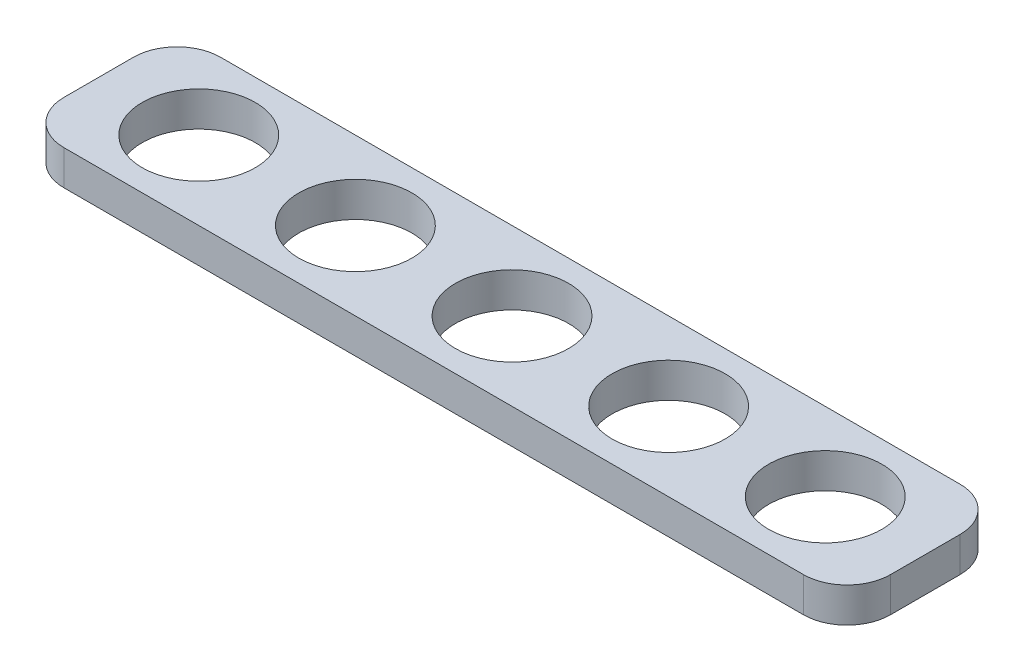
ISO-10303-21;
HEADER;
FILE_DESCRIPTION(('STEP AP214'),'2;1');
FILE_NAME('part.step','',(''),(''),'','','');
FILE_SCHEMA(('AUTOMOTIVE_DESIGN { 1 0 10303 214 1 1 1 1 }'));
ENDSEC;
DATA;
#1=APPLICATION_CONTEXT('core data for automotive mechanical design processes');
#2=APPLICATION_PROTOCOL_DEFINITION('international standard','automotive_design',2000,#1);
#3=PRODUCT_CONTEXT('',#1,'mechanical');
#4=PRODUCT('Part','Part','',(#3));
#5=PRODUCT_RELATED_PRODUCT_CATEGORY('part','',(#4));
#6=PRODUCT_DEFINITION_FORMATION('','',#4);
#7=PRODUCT_DEFINITION_CONTEXT('part definition',#1,'design');
#8=PRODUCT_DEFINITION('design','',#6,#7);
#9=PRODUCT_DEFINITION_SHAPE('','',#8);
#10=(LENGTH_UNIT() NAMED_UNIT(*) SI_UNIT(.MILLI.,.METRE.));
#11=(NAMED_UNIT(*) PLANE_ANGLE_UNIT() SI_UNIT($,.RADIAN.));
#12=(NAMED_UNIT(*) SI_UNIT($,.STERADIAN.) SOLID_ANGLE_UNIT());
#13=UNCERTAINTY_MEASURE_WITH_UNIT(LENGTH_MEASURE(1.E-05),#10,'distance_accuracy_value','');
#14=(GEOMETRIC_REPRESENTATION_CONTEXT(3) GLOBAL_UNCERTAINTY_ASSIGNED_CONTEXT((#13)) GLOBAL_UNIT_ASSIGNED_CONTEXT((#10,
#11,#12)) REPRESENTATION_CONTEXT('',''));
#15=CARTESIAN_POINT('',(0.,0.,0.));
#16=DIRECTION('',(0.,0.,1.));
#17=DIRECTION('',(1.,0.,0.));
#18=AXIS2_PLACEMENT_3D('',#15,#16,#17);
#19=CARTESIAN_POINT('',(0.,8.,0.));
#20=DIRECTION('',(1.,0.,0.));
#21=DIRECTION('',(0.,0.,-1.));
#22=AXIS2_PLACEMENT_3D('',#19,#20,#21);
#23=PLANE('',#22);
#24=DIRECTION('',(0.,0.,1.));
#25=VECTOR('',#24,1.);
#26=CARTESIAN_POINT('',(0.,8.,0.));
#27=LINE('',#26,#25);
#28=CARTESIAN_POINT('',(0.,8.,-26.));
#29=VERTEX_POINT('',#28);
#30=CARTESIAN_POINT('',(0.,8.,-10.));
#31=VERTEX_POINT('',#30);
#32=EDGE_CURVE('E146',#29,#31,#27,.T.);
#33=ORIENTED_EDGE('',*,*,#32,.F.);
#34=DIRECTION('',(0.,-1.,0.));
#35=VECTOR('',#34,1.);
#36=CARTESIAN_POINT('',(0.,8.,-26.));
#37=LINE('',#36,#35);
#38=CARTESIAN_POINT('',(0.,0.,-26.));
#39=VERTEX_POINT('',#38);
#40=EDGE_CURVE('E11',#29,#39,#37,.T.);
#41=ORIENTED_EDGE('',*,*,#40,.T.);
#42=DIRECTION('',(0.,0.,1.));
#43=VECTOR('',#42,1.);
#44=CARTESIAN_POINT('',(0.,0.,0.));
#45=LINE('',#44,#43);
#46=CARTESIAN_POINT('',(0.,0.,-10.));
#47=VERTEX_POINT('',#46);
#48=EDGE_CURVE('E148',#39,#47,#45,.T.);
#49=ORIENTED_EDGE('',*,*,#48,.T.);
#50=DIRECTION('',(0.,-1.,0.));
#51=VECTOR('',#50,1.);
#52=CARTESIAN_POINT('',(0.,8.,-10.));
#53=LINE('',#52,#51);
#54=EDGE_CURVE('E54',#47,#31,#53,.F.);
#55=ORIENTED_EDGE('',*,*,#54,.T.);
#56=EDGE_LOOP('',(#33,#41,#49,#55));
#57=FACE_BOUND('',#56,.T.);
#58=ADVANCED_FACE('F45',(#57),#23,.F.);
#59=CARTESIAN_POINT('',(0.,8.,0.));
#60=DIRECTION('',(0.,0.,-1.));
#61=DIRECTION('',(-1.,0.,0.));
#62=AXIS2_PLACEMENT_3D('',#59,#60,#61);
#63=PLANE('',#62);
#64=DIRECTION('',(1.,0.,0.));
#65=VECTOR('',#64,1.);
#66=CARTESIAN_POINT('',(0.,0.,0.));
#67=LINE('',#66,#65);
#68=CARTESIAN_POINT('',(10.,0.,0.));
#69=VERTEX_POINT('',#68);
#70=CARTESIAN_POINT('',(180.,0.,0.));
#71=VERTEX_POINT('',#70);
#72=EDGE_CURVE('E142',#69,#71,#67,.T.);
#73=ORIENTED_EDGE('',*,*,#72,.T.);
#74=DIRECTION('',(0.,-1.,0.));
#75=VECTOR('',#74,1.);
#76=CARTESIAN_POINT('',(180.,8.,0.));
#77=LINE('',#76,#75);
#78=CARTESIAN_POINT('',(180.,8.,0.));
#79=VERTEX_POINT('',#78);
#80=EDGE_CURVE('E118',#71,#79,#77,.F.);
#81=ORIENTED_EDGE('',*,*,#80,.T.);
#82=DIRECTION('',(1.,0.,0.));
#83=VECTOR('',#82,1.);
#84=CARTESIAN_POINT('',(0.,8.,0.));
#85=LINE('',#84,#83);
#86=CARTESIAN_POINT('',(10.,8.,0.));
#87=VERTEX_POINT('',#86);
#88=EDGE_CURVE('E198',#87,#79,#85,.T.);
#89=ORIENTED_EDGE('',*,*,#88,.F.);
#90=DIRECTION('',(0.,-1.,0.));
#91=VECTOR('',#90,1.);
#92=CARTESIAN_POINT('',(10.,8.,0.));
#93=LINE('',#92,#91);
#94=EDGE_CURVE('E124',#87,#69,#93,.T.);
#95=ORIENTED_EDGE('',*,*,#94,.T.);
#96=EDGE_LOOP('',(#73,#81,#89,#95));
#97=FACE_BOUND('',#96,.T.);
#98=ADVANCED_FACE('F202',(#97),#63,.F.);
#99=CARTESIAN_POINT('',(190.,8.,0.));
#100=DIRECTION('',(-1.,0.,0.));
#101=DIRECTION('',(0.,0.,1.));
#102=AXIS2_PLACEMENT_3D('',#99,#100,#101);
#103=PLANE('',#102);
#104=DIRECTION('',(0.,0.,-1.));
#105=VECTOR('',#104,1.);
#106=CARTESIAN_POINT('',(190.,8.,0.));
#107=LINE('',#106,#105);
#108=CARTESIAN_POINT('',(190.,8.,-10.));
#109=VERTEX_POINT('',#108);
#110=CARTESIAN_POINT('',(190.,8.,-26.));
#111=VERTEX_POINT('',#110);
#112=EDGE_CURVE('E133',#109,#111,#107,.T.);
#113=ORIENTED_EDGE('',*,*,#112,.F.);
#114=DIRECTION('',(0.,-1.,0.));
#115=VECTOR('',#114,1.);
#116=CARTESIAN_POINT('',(190.,8.,-10.));
#117=LINE('',#116,#115);
#118=CARTESIAN_POINT('',(190.,0.,-10.));
#119=VERTEX_POINT('',#118);
#120=EDGE_CURVE('E117',#109,#119,#117,.T.);
#121=ORIENTED_EDGE('',*,*,#120,.T.);
#122=DIRECTION('',(0.,0.,-1.));
#123=VECTOR('',#122,1.);
#124=CARTESIAN_POINT('',(190.,0.,0.));
#125=LINE('',#124,#123);
#126=CARTESIAN_POINT('',(190.,0.,-26.));
#127=VERTEX_POINT('',#126);
#128=EDGE_CURVE('E131',#119,#127,#125,.T.);
#129=ORIENTED_EDGE('',*,*,#128,.T.);
#130=DIRECTION('',(0.,-1.,0.));
#131=VECTOR('',#130,1.);
#132=CARTESIAN_POINT('',(190.,8.,-26.));
#133=LINE('',#132,#131);
#134=EDGE_CURVE('E136',#127,#111,#133,.F.);
#135=ORIENTED_EDGE('',*,*,#134,.T.);
#136=EDGE_LOOP('',(#113,#121,#129,#135));
#137=FACE_BOUND('',#136,.T.);
#138=ADVANCED_FACE('F130',(#137),#103,.F.);
#139=CARTESIAN_POINT('',(0.,8.,-36.));
#140=DIRECTION('',(0.,0.,1.));
#141=DIRECTION('',(1.,0.,0.));
#142=AXIS2_PLACEMENT_3D('',#139,#140,#141);
#143=PLANE('',#142);
#144=DIRECTION('',(-1.,0.,0.));
#145=VECTOR('',#144,1.);
#146=CARTESIAN_POINT('',(0.,8.,-36.));
#147=LINE('',#146,#145);
#148=CARTESIAN_POINT('',(180.,8.,-36.));
#149=VERTEX_POINT('',#148);
#150=CARTESIAN_POINT('',(10.,8.,-36.));
#151=VERTEX_POINT('',#150);
#152=EDGE_CURVE('E153',#149,#151,#147,.T.);
#153=ORIENTED_EDGE('',*,*,#152,.F.);
#154=DIRECTION('',(0.,-1.,0.));
#155=VECTOR('',#154,1.);
#156=CARTESIAN_POINT('',(180.,8.,-36.));
#157=LINE('',#156,#155);
#158=CARTESIAN_POINT('',(180.,0.,-36.));
#159=VERTEX_POINT('',#158);
#160=EDGE_CURVE('E180',#149,#159,#157,.T.);
#161=ORIENTED_EDGE('',*,*,#160,.T.);
#162=DIRECTION('',(-1.,0.,0.));
#163=VECTOR('',#162,1.);
#164=CARTESIAN_POINT('',(0.,0.,-36.));
#165=LINE('',#164,#163);
#166=CARTESIAN_POINT('',(10.,0.,-36.));
#167=VERTEX_POINT('',#166);
#168=EDGE_CURVE('E141',#159,#167,#165,.T.);
#169=ORIENTED_EDGE('',*,*,#168,.T.);
#170=DIRECTION('',(0.,-1.,0.));
#171=VECTOR('',#170,1.);
#172=CARTESIAN_POINT('',(10.,8.,-36.));
#173=LINE('',#172,#171);
#174=EDGE_CURVE('E61',#167,#151,#173,.F.);
#175=ORIENTED_EDGE('',*,*,#174,.T.);
#176=EDGE_LOOP('',(#153,#161,#169,#175));
#177=FACE_BOUND('',#176,.T.);
#178=ADVANCED_FACE('F256',(#177),#143,.F.);
#179=CARTESIAN_POINT('',(0.,8.,0.));
#180=DIRECTION('',(0.,-1.,0.));
#181=DIRECTION('',(0.,0.,-1.));
#182=AXIS2_PLACEMENT_3D('',#179,#180,#181);
#183=PLANE('',#182);
#184=CARTESIAN_POINT('',(23.,8.,-18.));
#185=DIRECTION('',(0.,1.,0.));
#186=DIRECTION('',(0.,0.,1.));
#187=AXIS2_PLACEMENT_3D('',#184,#185,#186);
#188=CIRCLE('',#187,13.);
#189=CARTESIAN_POINT('',(23.,8.,-4.99999999999999));
#190=VERTEX_POINT('',#189);
#191=EDGE_CURVE('E207',#190,#190,#188,.T.);
#192=ORIENTED_EDGE('',*,*,#191,.F.);
#193=EDGE_LOOP('',(#192));
#194=FACE_BOUND('',#193,.T.);
#195=CARTESIAN_POINT('',(59.,8.,-18.));
#196=DIRECTION('',(0.,1.,0.));
#197=DIRECTION('',(0.,0.,1.));
#198=AXIS2_PLACEMENT_3D('',#195,#196,#197);
#199=CIRCLE('',#198,13.);
#200=CARTESIAN_POINT('',(59.,8.,-4.99999999999998));
#201=VERTEX_POINT('',#200);
#202=EDGE_CURVE('E244',#201,#201,#199,.T.);
#203=ORIENTED_EDGE('',*,*,#202,.F.);
#204=EDGE_LOOP('',(#203));
#205=FACE_BOUND('',#204,.T.);
#206=CARTESIAN_POINT('',(95.0046201605951,8.,-18.));
#207=DIRECTION('',(0.,1.,0.));
#208=DIRECTION('',(0.,0.,1.));
#209=AXIS2_PLACEMENT_3D('',#206,#207,#208);
#210=CIRCLE('',#209,13.);
#211=CARTESIAN_POINT('',(95.0046201605951,8.,-5.));
#212=VERTEX_POINT('',#211);
#213=EDGE_CURVE('E236',#212,#212,#210,.T.);
#214=ORIENTED_EDGE('',*,*,#213,.F.);
#215=EDGE_LOOP('',(#214));
#216=FACE_BOUND('',#215,.T.);
#217=CARTESIAN_POINT('',(131.004620160595,8.,-18.));
#218=DIRECTION('',(0.,1.,0.));
#219=DIRECTION('',(0.,0.,1.));
#220=AXIS2_PLACEMENT_3D('',#217,#218,#219);
#221=CIRCLE('',#220,13.);
#222=CARTESIAN_POINT('',(131.004620160595,8.,-5.00000000000002));
#223=VERTEX_POINT('',#222);
#224=EDGE_CURVE('E228',#223,#223,#221,.T.);
#225=ORIENTED_EDGE('',*,*,#224,.F.);
#226=EDGE_LOOP('',(#225));
#227=FACE_BOUND('',#226,.T.);
#228=CARTESIAN_POINT('',(167.002310080298,8.,-18.));
#229=DIRECTION('',(0.,1.,0.));
#230=DIRECTION('',(0.,0.,1.));
#231=AXIS2_PLACEMENT_3D('',#228,#229,#230);
#232=CIRCLE('',#231,12.9976899197025);
#233=CARTESIAN_POINT('',(167.002310080298,8.,-5.00231008029754));
#234=VERTEX_POINT('',#233);
#235=EDGE_CURVE('E220',#234,#234,#232,.T.);
#236=ORIENTED_EDGE('',*,*,#235,.F.);
#237=EDGE_LOOP('',(#236));
#238=FACE_BOUND('',#237,.T.);
#239=ORIENTED_EDGE('',*,*,#88,.T.);
#240=CARTESIAN_POINT('',(180.,8.,-10.));
#241=DIRECTION('',(0.,-1.,0.));
#242=DIRECTION('',(0.,0.,-1.));
#243=AXIS2_PLACEMENT_3D('',#240,#241,#242);
#244=CIRCLE('',#243,10.);
#245=EDGE_CURVE('E175',#79,#109,#244,.F.);
#246=ORIENTED_EDGE('',*,*,#245,.T.);
#247=ORIENTED_EDGE('',*,*,#112,.T.);
#248=CARTESIAN_POINT('',(180.,8.,-26.));
#249=DIRECTION('',(0.,-1.,0.));
#250=DIRECTION('',(0.,0.,-1.));
#251=AXIS2_PLACEMENT_3D('',#248,#249,#250);
#252=CIRCLE('',#251,10.);
#253=EDGE_CURVE('E68',#111,#149,#252,.F.);
#254=ORIENTED_EDGE('',*,*,#253,.T.);
#255=ORIENTED_EDGE('',*,*,#152,.T.);
#256=CARTESIAN_POINT('',(10.,8.,-26.));
#257=DIRECTION('',(0.,-1.,0.));
#258=DIRECTION('',(0.,0.,-1.));
#259=AXIS2_PLACEMENT_3D('',#256,#257,#258);
#260=CIRCLE('',#259,10.);
#261=EDGE_CURVE('E170',#151,#29,#260,.F.);
#262=ORIENTED_EDGE('',*,*,#261,.T.);
#263=ORIENTED_EDGE('',*,*,#32,.T.);
#264=CARTESIAN_POINT('',(10.,8.,-10.));
#265=DIRECTION('',(0.,-1.,0.));
#266=DIRECTION('',(0.,0.,-1.));
#267=AXIS2_PLACEMENT_3D('',#264,#265,#266);
#268=CIRCLE('',#267,10.);
#269=EDGE_CURVE('E167',#31,#87,#268,.F.);
#270=ORIENTED_EDGE('',*,*,#269,.T.);
#271=EDGE_LOOP('',(#239,#246,#247,#254,#255,#262,#263,#270));
#272=FACE_BOUND('',#271,.T.);
#273=ADVANCED_FACE('F194',(#194,#205,#216,#227,#238,#272),#183,.F.);
#274=CARTESIAN_POINT('',(0.,0.,0.));
#275=DIRECTION('',(0.,-1.,0.));
#276=DIRECTION('',(0.,0.,-1.));
#277=AXIS2_PLACEMENT_3D('',#274,#275,#276);
#278=PLANE('',#277);
#279=CARTESIAN_POINT('',(23.,0.,-18.));
#280=DIRECTION('',(0.,1.,0.));
#281=DIRECTION('',(0.,0.,1.));
#282=AXIS2_PLACEMENT_3D('',#279,#280,#281);
#283=CIRCLE('',#282,13.);
#284=CARTESIAN_POINT('',(23.,0.,-4.99999999999999));
#285=VERTEX_POINT('',#284);
#286=EDGE_CURVE('E204',#285,#285,#283,.T.);
#287=ORIENTED_EDGE('',*,*,#286,.T.);
#288=EDGE_LOOP('',(#287));
#289=FACE_BOUND('',#288,.T.);
#290=CARTESIAN_POINT('',(59.,0.,-18.));
#291=DIRECTION('',(0.,1.,0.));
#292=DIRECTION('',(0.,0.,1.));
#293=AXIS2_PLACEMENT_3D('',#290,#291,#292);
#294=CIRCLE('',#293,13.);
#295=CARTESIAN_POINT('',(59.,0.,-4.99999999999998));
#296=VERTEX_POINT('',#295);
#297=EDGE_CURVE('E240',#296,#296,#294,.T.);
#298=ORIENTED_EDGE('',*,*,#297,.T.);
#299=EDGE_LOOP('',(#298));
#300=FACE_BOUND('',#299,.T.);
#301=CARTESIAN_POINT('',(95.0046201605951,0.,-18.));
#302=DIRECTION('',(0.,1.,0.));
#303=DIRECTION('',(0.,0.,1.));
#304=AXIS2_PLACEMENT_3D('',#301,#302,#303);
#305=CIRCLE('',#304,13.);
#306=CARTESIAN_POINT('',(95.0046201605951,0.,-5.));
#307=VERTEX_POINT('',#306);
#308=EDGE_CURVE('E232',#307,#307,#305,.T.);
#309=ORIENTED_EDGE('',*,*,#308,.T.);
#310=EDGE_LOOP('',(#309));
#311=FACE_BOUND('',#310,.T.);
#312=CARTESIAN_POINT('',(131.004620160595,0.,-18.));
#313=DIRECTION('',(0.,1.,0.));
#314=DIRECTION('',(0.,0.,1.));
#315=AXIS2_PLACEMENT_3D('',#312,#313,#314);
#316=CIRCLE('',#315,13.);
#317=CARTESIAN_POINT('',(131.004620160595,0.,-5.00000000000002));
#318=VERTEX_POINT('',#317);
#319=EDGE_CURVE('E224',#318,#318,#316,.T.);
#320=ORIENTED_EDGE('',*,*,#319,.T.);
#321=EDGE_LOOP('',(#320));
#322=FACE_BOUND('',#321,.T.);
#323=CARTESIAN_POINT('',(167.002310080298,0.,-18.));
#324=DIRECTION('',(0.,1.,0.));
#325=DIRECTION('',(0.,0.,1.));
#326=AXIS2_PLACEMENT_3D('',#323,#324,#325);
#327=CIRCLE('',#326,12.9976899197025);
#328=CARTESIAN_POINT('',(167.002310080298,0.,-5.00231008029754));
#329=VERTEX_POINT('',#328);
#330=EDGE_CURVE('E216',#329,#329,#327,.T.);
#331=ORIENTED_EDGE('',*,*,#330,.T.);
#332=EDGE_LOOP('',(#331));
#333=FACE_BOUND('',#332,.T.);
#334=ORIENTED_EDGE('',*,*,#128,.F.);
#335=CARTESIAN_POINT('',(180.,0.,-10.));
#336=DIRECTION('',(0.,-1.,0.));
#337=DIRECTION('',(0.,0.,-1.));
#338=AXIS2_PLACEMENT_3D('',#335,#336,#337);
#339=CIRCLE('',#338,10.);
#340=EDGE_CURVE('E113',#119,#71,#339,.T.);
#341=ORIENTED_EDGE('',*,*,#340,.T.);
#342=ORIENTED_EDGE('',*,*,#72,.F.);
#343=CARTESIAN_POINT('',(10.,0.,-10.));
#344=DIRECTION('',(0.,-1.,0.));
#345=DIRECTION('',(0.,0.,-1.));
#346=AXIS2_PLACEMENT_3D('',#343,#344,#345);
#347=CIRCLE('',#346,10.);
#348=EDGE_CURVE('E135',#69,#47,#347,.T.);
#349=ORIENTED_EDGE('',*,*,#348,.T.);
#350=ORIENTED_EDGE('',*,*,#48,.F.);
#351=CARTESIAN_POINT('',(10.,0.,-26.));
#352=DIRECTION('',(0.,-1.,0.));
#353=DIRECTION('',(0.,0.,-1.));
#354=AXIS2_PLACEMENT_3D('',#351,#352,#353);
#355=CIRCLE('',#354,10.);
#356=EDGE_CURVE('E157',#39,#167,#355,.T.);
#357=ORIENTED_EDGE('',*,*,#356,.T.);
#358=ORIENTED_EDGE('',*,*,#168,.F.);
#359=CARTESIAN_POINT('',(180.,0.,-26.));
#360=DIRECTION('',(0.,-1.,0.));
#361=DIRECTION('',(0.,0.,-1.));
#362=AXIS2_PLACEMENT_3D('',#359,#360,#361);
#363=CIRCLE('',#362,10.);
#364=EDGE_CURVE('E125',#159,#127,#363,.T.);
#365=ORIENTED_EDGE('',*,*,#364,.T.);
#366=EDGE_LOOP('',(#334,#341,#342,#349,#350,#357,#358,#365));
#367=FACE_BOUND('',#366,.T.);
#368=ADVANCED_FACE('F138',(#289,#300,#311,#322,#333,#367),#278,.T.);
#369=CARTESIAN_POINT('',(167.002310080298,0.,-18.));
#370=DIRECTION('',(0.,1.,0.));
#371=DIRECTION('',(0.,0.,1.));
#372=AXIS2_PLACEMENT_3D('',#369,#370,#371);
#373=CYLINDRICAL_SURFACE('',#372,12.9976899197025);
#374=ORIENTED_EDGE('',*,*,#330,.F.);
#375=EDGE_LOOP('',(#374));
#376=FACE_BOUND('',#375,.T.);
#377=ORIENTED_EDGE('',*,*,#235,.T.);
#378=EDGE_LOOP('',(#377));
#379=FACE_BOUND('',#378,.T.);
#380=ADVANCED_FACE('F266',(#376,#379),#373,.F.);
#381=CARTESIAN_POINT('',(131.004620160595,0.,-18.));
#382=DIRECTION('',(0.,1.,0.));
#383=DIRECTION('',(0.,0.,1.));
#384=AXIS2_PLACEMENT_3D('',#381,#382,#383);
#385=CYLINDRICAL_SURFACE('',#384,13.);
#386=ORIENTED_EDGE('',*,*,#319,.F.);
#387=EDGE_LOOP('',(#386));
#388=FACE_BOUND('',#387,.T.);
#389=ORIENTED_EDGE('',*,*,#224,.T.);
#390=EDGE_LOOP('',(#389));
#391=FACE_BOUND('',#390,.T.);
#392=ADVANCED_FACE('F268',(#388,#391),#385,.F.);
#393=CARTESIAN_POINT('',(95.0046201605951,0.,-18.));
#394=DIRECTION('',(0.,1.,0.));
#395=DIRECTION('',(0.,0.,1.));
#396=AXIS2_PLACEMENT_3D('',#393,#394,#395);
#397=CYLINDRICAL_SURFACE('',#396,13.);
#398=ORIENTED_EDGE('',*,*,#308,.F.);
#399=EDGE_LOOP('',(#398));
#400=FACE_BOUND('',#399,.T.);
#401=ORIENTED_EDGE('',*,*,#213,.T.);
#402=EDGE_LOOP('',(#401));
#403=FACE_BOUND('',#402,.T.);
#404=ADVANCED_FACE('F274',(#400,#403),#397,.F.);
#405=CARTESIAN_POINT('',(59.,0.,-18.));
#406=DIRECTION('',(0.,1.,0.));
#407=DIRECTION('',(0.,0.,1.));
#408=AXIS2_PLACEMENT_3D('',#405,#406,#407);
#409=CYLINDRICAL_SURFACE('',#408,13.);
#410=ORIENTED_EDGE('',*,*,#297,.F.);
#411=EDGE_LOOP('',(#410));
#412=FACE_BOUND('',#411,.T.);
#413=ORIENTED_EDGE('',*,*,#202,.T.);
#414=EDGE_LOOP('',(#413));
#415=FACE_BOUND('',#414,.T.);
#416=ADVANCED_FACE('F328',(#412,#415),#409,.F.);
#417=CARTESIAN_POINT('',(23.,0.,-18.));
#418=DIRECTION('',(0.,1.,0.));
#419=DIRECTION('',(0.,0.,1.));
#420=AXIS2_PLACEMENT_3D('',#417,#418,#419);
#421=CYLINDRICAL_SURFACE('',#420,13.);
#422=ORIENTED_EDGE('',*,*,#286,.F.);
#423=EDGE_LOOP('',(#422));
#424=FACE_BOUND('',#423,.T.);
#425=ORIENTED_EDGE('',*,*,#191,.T.);
#426=EDGE_LOOP('',(#425));
#427=FACE_BOUND('',#426,.T.);
#428=ADVANCED_FACE('F252',(#424,#427),#421,.F.);
#429=CARTESIAN_POINT('',(180.,8.,-10.));
#430=DIRECTION('',(0.,-1.,0.));
#431=DIRECTION('',(0.,0.,-1.));
#432=AXIS2_PLACEMENT_3D('',#429,#430,#431);
#433=CYLINDRICAL_SURFACE('',#432,10.);
#434=ORIENTED_EDGE('',*,*,#245,.F.);
#435=ORIENTED_EDGE('',*,*,#80,.F.);
#436=ORIENTED_EDGE('',*,*,#340,.F.);
#437=ORIENTED_EDGE('',*,*,#120,.F.);
#438=EDGE_LOOP('',(#434,#435,#436,#437));
#439=FACE_BOUND('',#438,.T.);
#440=ADVANCED_FACE('F116',(#439),#433,.T.);
#441=CARTESIAN_POINT('',(180.,8.,-26.));
#442=DIRECTION('',(0.,-1.,0.));
#443=DIRECTION('',(0.,0.,-1.));
#444=AXIS2_PLACEMENT_3D('',#441,#442,#443);
#445=CYLINDRICAL_SURFACE('',#444,10.);
#446=ORIENTED_EDGE('',*,*,#253,.F.);
#447=ORIENTED_EDGE('',*,*,#134,.F.);
#448=ORIENTED_EDGE('',*,*,#364,.F.);
#449=ORIENTED_EDGE('',*,*,#160,.F.);
#450=EDGE_LOOP('',(#446,#447,#448,#449));
#451=FACE_BOUND('',#450,.T.);
#452=ADVANCED_FACE('F292',(#451),#445,.T.);
#453=CARTESIAN_POINT('',(10.,8.,-26.));
#454=DIRECTION('',(0.,-1.,0.));
#455=DIRECTION('',(0.,0.,-1.));
#456=AXIS2_PLACEMENT_3D('',#453,#454,#455);
#457=CYLINDRICAL_SURFACE('',#456,10.);
#458=ORIENTED_EDGE('',*,*,#261,.F.);
#459=ORIENTED_EDGE('',*,*,#174,.F.);
#460=ORIENTED_EDGE('',*,*,#356,.F.);
#461=ORIENTED_EDGE('',*,*,#40,.F.);
#462=EDGE_LOOP('',(#458,#459,#460,#461));
#463=FACE_BOUND('',#462,.T.);
#464=ADVANCED_FACE('F294',(#463),#457,.T.);
#465=CARTESIAN_POINT('',(10.,8.,-10.));
#466=DIRECTION('',(0.,-1.,0.));
#467=DIRECTION('',(0.,0.,-1.));
#468=AXIS2_PLACEMENT_3D('',#465,#466,#467);
#469=CYLINDRICAL_SURFACE('',#468,10.);
#470=ORIENTED_EDGE('',*,*,#269,.F.);
#471=ORIENTED_EDGE('',*,*,#54,.F.);
#472=ORIENTED_EDGE('',*,*,#348,.F.);
#473=ORIENTED_EDGE('',*,*,#94,.F.);
#474=EDGE_LOOP('',(#470,#471,#472,#473));
#475=FACE_BOUND('',#474,.T.);
#476=ADVANCED_FACE('F47',(#475),#469,.T.);
#477=CLOSED_SHELL('',(#58,#98,#138,#178,#273,#368,#380,#392,#404,#416,#428,#440,#452,#464,#476));
#478=MANIFOLD_SOLID_BREP('B2',#477);
#479=ADVANCED_BREP_SHAPE_REPRESENTATION('',(#18,#478),#14);
#480=SHAPE_DEFINITION_REPRESENTATION(#9,#479);
ENDSEC;
END-ISO-10303-21;
